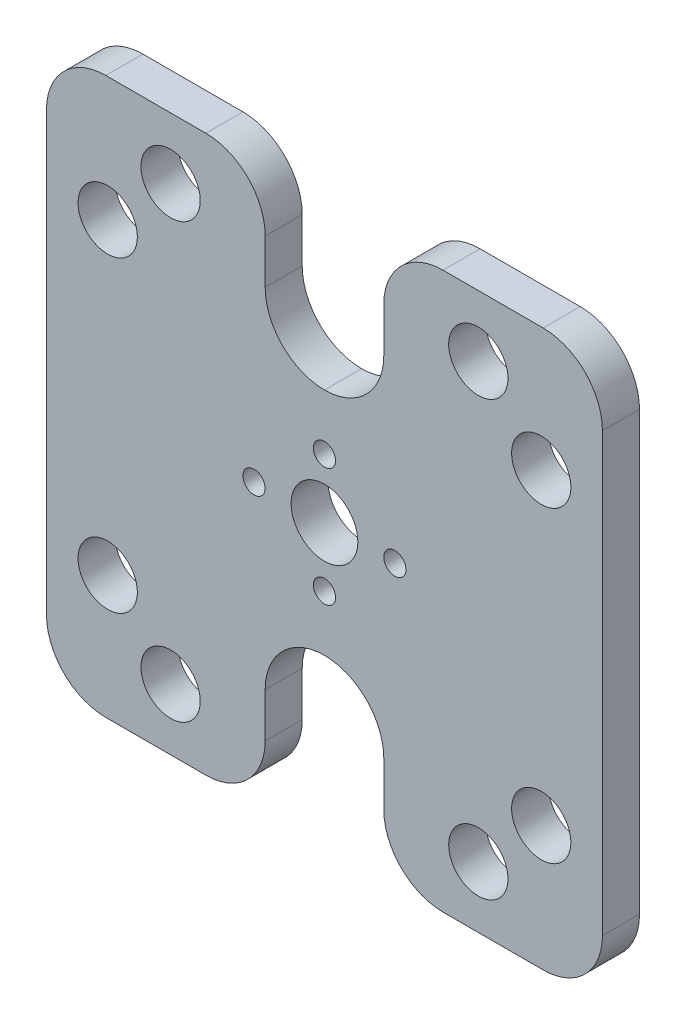
ISO-10303-21;
HEADER;
FILE_DESCRIPTION(('STEP AP214'),'2;1');
FILE_NAME('part.step','',(''),(''),'','','');
FILE_SCHEMA(('AUTOMOTIVE_DESIGN { 1 0 10303 214 1 1 1 1 }'));
ENDSEC;
DATA;
#1=APPLICATION_CONTEXT('core data for automotive mechanical design processes');
#2=APPLICATION_PROTOCOL_DEFINITION('international standard','automotive_design',2000,#1);
#3=PRODUCT_CONTEXT('',#1,'mechanical');
#4=PRODUCT('Part','Part','',(#3));
#5=PRODUCT_RELATED_PRODUCT_CATEGORY('part','',(#4));
#6=PRODUCT_DEFINITION_FORMATION('','',#4);
#7=PRODUCT_DEFINITION_CONTEXT('part definition',#1,'design');
#8=PRODUCT_DEFINITION('design','',#6,#7);
#9=PRODUCT_DEFINITION_SHAPE('','',#8);
#10=(LENGTH_UNIT() NAMED_UNIT(*) SI_UNIT(.MILLI.,.METRE.));
#11=(NAMED_UNIT(*) PLANE_ANGLE_UNIT() SI_UNIT($,.RADIAN.));
#12=(NAMED_UNIT(*) SI_UNIT($,.STERADIAN.) SOLID_ANGLE_UNIT());
#13=UNCERTAINTY_MEASURE_WITH_UNIT(LENGTH_MEASURE(1.E-05),#10,'distance_accuracy_value','');
#14=(GEOMETRIC_REPRESENTATION_CONTEXT(3) GLOBAL_UNCERTAINTY_ASSIGNED_CONTEXT((#13)) GLOBAL_UNIT_ASSIGNED_CONTEXT((#10,
#11,#12)) REPRESENTATION_CONTEXT('',''));
#15=CARTESIAN_POINT('',(0.,0.,0.));
#16=DIRECTION('',(0.,0.,1.));
#17=DIRECTION('',(1.,0.,0.));
#18=AXIS2_PLACEMENT_3D('',#15,#16,#17);
#19=CARTESIAN_POINT('',(-37.5,37.5,5.));
#20=DIRECTION('',(0.,-1.,0.));
#21=DIRECTION('',(1.,0.,0.));
#22=AXIS2_PLACEMENT_3D('',#19,#20,#21);
#23=PLANE('',#22);
#24=DIRECTION('',(-1.,0.,0.));
#25=VECTOR('',#24,1.);
#26=CARTESIAN_POINT('',(-37.5,37.5,5.));
#27=LINE('',#26,#25);
#28=CARTESIAN_POINT('',(29.5,37.5,5.));
#29=VERTEX_POINT('',#28);
#30=CARTESIAN_POINT('',(16.,37.5,5.));
#31=VERTEX_POINT('',#30);
#32=EDGE_CURVE('E427',#29,#31,#27,.T.);
#33=ORIENTED_EDGE('',*,*,#32,.F.);
#34=DIRECTION('',(0.,0.,-1.));
#35=VECTOR('',#34,1.);
#36=CARTESIAN_POINT('',(29.5,37.5,5.));
#37=LINE('',#36,#35);
#38=CARTESIAN_POINT('',(29.5,37.5,0.));
#39=VERTEX_POINT('',#38);
#40=EDGE_CURVE('E276',#29,#39,#37,.T.);
#41=ORIENTED_EDGE('',*,*,#40,.T.);
#42=DIRECTION('',(-1.,0.,0.));
#43=VECTOR('',#42,1.);
#44=CARTESIAN_POINT('',(-37.5,37.5,0.));
#45=LINE('',#44,#43);
#46=CARTESIAN_POINT('',(16.,37.5,0.));
#47=VERTEX_POINT('',#46);
#48=EDGE_CURVE('E438',#39,#47,#45,.T.);
#49=ORIENTED_EDGE('',*,*,#48,.T.);
#50=DIRECTION('',(0.,0.,1.));
#51=VECTOR('',#50,1.);
#52=CARTESIAN_POINT('',(16.,37.5,5.));
#53=LINE('',#52,#51);
#54=EDGE_CURVE('E273',#47,#31,#53,.T.);
#55=ORIENTED_EDGE('',*,*,#54,.T.);
#56=EDGE_LOOP('',(#33,#41,#49,#55));
#57=FACE_BOUND('',#56,.T.);
#58=ADVANCED_FACE('F33',(#57),#23,.F.);
#59=CARTESIAN_POINT('',(-37.5,-37.5,5.));
#60=DIRECTION('',(0.,1.,0.));
#61=DIRECTION('',(-1.,0.,0.));
#62=AXIS2_PLACEMENT_3D('',#59,#60,#61);
#63=PLANE('',#62);
#64=DIRECTION('',(1.,0.,0.));
#65=VECTOR('',#64,1.);
#66=CARTESIAN_POINT('',(-37.5,-37.5,5.));
#67=LINE('',#66,#65);
#68=CARTESIAN_POINT('',(-29.5,-37.5,5.));
#69=VERTEX_POINT('',#68);
#70=CARTESIAN_POINT('',(-16.,-37.5,5.));
#71=VERTEX_POINT('',#70);
#72=EDGE_CURVE('E203',#69,#71,#67,.T.);
#73=ORIENTED_EDGE('',*,*,#72,.F.);
#74=DIRECTION('',(0.,0.,-1.));
#75=VECTOR('',#74,1.);
#76=CARTESIAN_POINT('',(-29.5,-37.5,5.));
#77=LINE('',#76,#75);
#78=CARTESIAN_POINT('',(-29.5,-37.5,0.));
#79=VERTEX_POINT('',#78);
#80=EDGE_CURVE('E187',#69,#79,#77,.T.);
#81=ORIENTED_EDGE('',*,*,#80,.T.);
#82=DIRECTION('',(1.,0.,0.));
#83=VECTOR('',#82,1.);
#84=CARTESIAN_POINT('',(-37.5,-37.5,0.));
#85=LINE('',#84,#83);
#86=CARTESIAN_POINT('',(-16.,-37.5,0.));
#87=VERTEX_POINT('',#86);
#88=EDGE_CURVE('E200',#79,#87,#85,.T.);
#89=ORIENTED_EDGE('',*,*,#88,.T.);
#90=DIRECTION('',(0.,0.,1.));
#91=VECTOR('',#90,1.);
#92=CARTESIAN_POINT('',(-16.,-37.5,5.));
#93=LINE('',#92,#91);
#94=EDGE_CURVE('E205',#87,#71,#93,.T.);
#95=ORIENTED_EDGE('',*,*,#94,.T.);
#96=EDGE_LOOP('',(#73,#81,#89,#95));
#97=FACE_BOUND('',#96,.T.);
#98=ADVANCED_FACE('F198',(#97),#63,.F.);
#99=CARTESIAN_POINT('',(0.,0.,5.));
#100=DIRECTION('',(0.,0.,1.));
#101=DIRECTION('',(1.,0.,0.));
#102=AXIS2_PLACEMENT_3D('',#99,#100,#101);
#103=PLANE('',#102);
#104=DIRECTION('',(0.,-1.,0.));
#105=VECTOR('',#104,1.);
#106=CARTESIAN_POINT('',(-37.5,37.5,5.));
#107=LINE('',#106,#105);
#108=CARTESIAN_POINT('',(-37.5,29.5,5.));
#109=VERTEX_POINT('',#108);
#110=CARTESIAN_POINT('',(-37.5,-29.5,5.));
#111=VERTEX_POINT('',#110);
#112=EDGE_CURVE('E430',#109,#111,#107,.T.);
#113=ORIENTED_EDGE('',*,*,#112,.T.);
#114=CARTESIAN_POINT('',(-29.5,-29.5,5.));
#115=DIRECTION('',(0.,0.,1.));
#116=DIRECTION('',(1.,0.,0.));
#117=AXIS2_PLACEMENT_3D('',#114,#115,#116);
#118=CIRCLE('',#117,8.);
#119=EDGE_CURVE('E252',#111,#69,#118,.T.);
#120=ORIENTED_EDGE('',*,*,#119,.T.);
#121=ORIENTED_EDGE('',*,*,#72,.T.);
#122=CARTESIAN_POINT('',(-16.,-29.5,5.));
#123=DIRECTION('',(0.,0.,1.));
#124=DIRECTION('',(1.,0.,0.));
#125=AXIS2_PLACEMENT_3D('',#122,#123,#124);
#126=CIRCLE('',#125,8.);
#127=CARTESIAN_POINT('',(-8.,-29.5,5.));
#128=VERTEX_POINT('',#127);
#129=EDGE_CURVE('E250',#71,#128,#126,.T.);
#130=ORIENTED_EDGE('',*,*,#129,.T.);
#131=DIRECTION('',(0.,-1.,0.));
#132=VECTOR('',#131,1.);
#133=CARTESIAN_POINT('',(-8.,-15.5,5.));
#134=LINE('',#133,#132);
#135=CARTESIAN_POINT('',(-8.,-23.5,5.));
#136=VERTEX_POINT('',#135);
#137=EDGE_CURVE('E306',#136,#128,#134,.T.);
#138=ORIENTED_EDGE('',*,*,#137,.F.);
#139=CARTESIAN_POINT('',(0.,-23.5,5.));
#140=DIRECTION('',(0.,0.,1.));
#141=DIRECTION('',(1.,0.,0.));
#142=AXIS2_PLACEMENT_3D('',#139,#140,#141);
#143=CIRCLE('',#142,8.);
#144=CARTESIAN_POINT('',(0.,-15.5,5.));
#145=VERTEX_POINT('',#144);
#146=EDGE_CURVE('E297',#136,#145,#143,.F.);
#147=ORIENTED_EDGE('',*,*,#146,.T.);
#148=CARTESIAN_POINT('',(0.,-23.5,5.));
#149=DIRECTION('',(0.,0.,1.));
#150=DIRECTION('',(1.,0.,0.));
#151=AXIS2_PLACEMENT_3D('',#148,#149,#150);
#152=CIRCLE('',#151,8.);
#153=CARTESIAN_POINT('',(8.,-23.5,5.));
#154=VERTEX_POINT('',#153);
#155=EDGE_CURVE('E293',#145,#154,#152,.F.);
#156=ORIENTED_EDGE('',*,*,#155,.T.);
#157=DIRECTION('',(0.,1.,0.));
#158=VECTOR('',#157,1.);
#159=CARTESIAN_POINT('',(8.,-15.5,5.));
#160=LINE('',#159,#158);
#161=CARTESIAN_POINT('',(8.,-29.5,5.));
#162=VERTEX_POINT('',#161);
#163=EDGE_CURVE('E311',#162,#154,#160,.T.);
#164=ORIENTED_EDGE('',*,*,#163,.F.);
#165=CARTESIAN_POINT('',(16.,-29.5,5.));
#166=DIRECTION('',(0.,0.,1.));
#167=DIRECTION('',(1.,0.,0.));
#168=AXIS2_PLACEMENT_3D('',#165,#166,#167);
#169=CIRCLE('',#168,8.);
#170=CARTESIAN_POINT('',(16.,-37.5,5.));
#171=VERTEX_POINT('',#170);
#172=EDGE_CURVE('E248',#162,#171,#169,.T.);
#173=ORIENTED_EDGE('',*,*,#172,.T.);
#174=CARTESIAN_POINT('',(29.5,-37.5,5.));
#175=VERTEX_POINT('',#174);
#176=EDGE_CURVE('E432',#171,#175,#67,.T.);
#177=ORIENTED_EDGE('',*,*,#176,.T.);
#178=CARTESIAN_POINT('',(29.5,-29.5,5.));
#179=DIRECTION('',(0.,0.,1.));
#180=DIRECTION('',(1.,0.,0.));
#181=AXIS2_PLACEMENT_3D('',#178,#179,#180);
#182=CIRCLE('',#181,8.);
#183=CARTESIAN_POINT('',(37.5,-29.5,5.));
#184=VERTEX_POINT('',#183);
#185=EDGE_CURVE('E246',#175,#184,#182,.T.);
#186=ORIENTED_EDGE('',*,*,#185,.T.);
#187=DIRECTION('',(0.,1.,0.));
#188=VECTOR('',#187,1.);
#189=CARTESIAN_POINT('',(37.5,37.5,5.));
#190=LINE('',#189,#188);
#191=CARTESIAN_POINT('',(37.5,29.5,5.));
#192=VERTEX_POINT('',#191);
#193=EDGE_CURVE('E211',#184,#192,#190,.T.);
#194=ORIENTED_EDGE('',*,*,#193,.T.);
#195=CARTESIAN_POINT('',(29.5,29.5,5.));
#196=DIRECTION('',(0.,0.,1.));
#197=DIRECTION('',(1.,0.,0.));
#198=AXIS2_PLACEMENT_3D('',#195,#196,#197);
#199=CIRCLE('',#198,8.);
#200=EDGE_CURVE('E244',#192,#29,#199,.T.);
#201=ORIENTED_EDGE('',*,*,#200,.T.);
#202=ORIENTED_EDGE('',*,*,#32,.T.);
#203=CARTESIAN_POINT('',(16.,29.5,5.));
#204=DIRECTION('',(0.,0.,1.));
#205=DIRECTION('',(1.,0.,0.));
#206=AXIS2_PLACEMENT_3D('',#203,#204,#205);
#207=CIRCLE('',#206,8.);
#208=CARTESIAN_POINT('',(8.,29.5,5.));
#209=VERTEX_POINT('',#208);
#210=EDGE_CURVE('E242',#31,#209,#207,.T.);
#211=ORIENTED_EDGE('',*,*,#210,.T.);
#212=DIRECTION('',(0.,1.,0.));
#213=VECTOR('',#212,1.);
#214=CARTESIAN_POINT('',(8.,15.5,5.));
#215=LINE('',#214,#213);
#216=CARTESIAN_POINT('',(8.,23.5,5.));
#217=VERTEX_POINT('',#216);
#218=EDGE_CURVE('E332',#217,#209,#215,.T.);
#219=ORIENTED_EDGE('',*,*,#218,.F.);
#220=CARTESIAN_POINT('',(0.,23.5,5.));
#221=DIRECTION('',(0.,0.,1.));
#222=DIRECTION('',(1.,0.,0.));
#223=AXIS2_PLACEMENT_3D('',#220,#221,#222);
#224=CIRCLE('',#223,8.);
#225=CARTESIAN_POINT('',(0.,15.5,5.));
#226=VERTEX_POINT('',#225);
#227=EDGE_CURVE('E56',#217,#226,#224,.F.);
#228=ORIENTED_EDGE('',*,*,#227,.T.);
#229=CARTESIAN_POINT('',(0.,23.5,5.));
#230=DIRECTION('',(0.,0.,1.));
#231=DIRECTION('',(1.,0.,0.));
#232=AXIS2_PLACEMENT_3D('',#229,#230,#231);
#233=CIRCLE('',#232,8.);
#234=CARTESIAN_POINT('',(-8.,23.5,5.));
#235=VERTEX_POINT('',#234);
#236=EDGE_CURVE('E42',#226,#235,#233,.F.);
#237=ORIENTED_EDGE('',*,*,#236,.T.);
#238=DIRECTION('',(0.,-1.,0.));
#239=VECTOR('',#238,1.);
#240=CARTESIAN_POINT('',(-8.,15.5,5.));
#241=LINE('',#240,#239);
#242=CARTESIAN_POINT('',(-8.,29.5,5.));
#243=VERTEX_POINT('',#242);
#244=EDGE_CURVE('E326',#243,#235,#241,.T.);
#245=ORIENTED_EDGE('',*,*,#244,.F.);
#246=CARTESIAN_POINT('',(-16.,29.5,5.));
#247=DIRECTION('',(0.,0.,1.));
#248=DIRECTION('',(1.,0.,0.));
#249=AXIS2_PLACEMENT_3D('',#246,#247,#248);
#250=CIRCLE('',#249,8.);
#251=CARTESIAN_POINT('',(-16.,37.5,5.));
#252=VERTEX_POINT('',#251);
#253=EDGE_CURVE('E240',#243,#252,#250,.T.);
#254=ORIENTED_EDGE('',*,*,#253,.T.);
#255=CARTESIAN_POINT('',(-29.5,37.5,5.));
#256=VERTEX_POINT('',#255);
#257=EDGE_CURVE('E215',#252,#256,#27,.T.);
#258=ORIENTED_EDGE('',*,*,#257,.T.);
#259=CARTESIAN_POINT('',(-29.5,29.5,5.));
#260=DIRECTION('',(0.,0.,1.));
#261=DIRECTION('',(1.,0.,0.));
#262=AXIS2_PLACEMENT_3D('',#259,#260,#261);
#263=CIRCLE('',#262,8.);
#264=EDGE_CURVE('E238',#256,#109,#263,.T.);
#265=ORIENTED_EDGE('',*,*,#264,.T.);
#266=EDGE_LOOP('',(#113,#120,#121,#130,#138,#147,#156,#164,#173,#177,#186,#194,#201,#202,#211,
#219,#228,#237,#245,#254,#258,#265));
#267=FACE_BOUND('',#266,.T.);
#268=CARTESIAN_POINT('',(20.7573593128807,-29.2426406871193,5.));
#269=DIRECTION('',(0.,0.,1.));
#270=DIRECTION('',(-1.,0.,0.));
#271=AXIS2_PLACEMENT_3D('',#268,#269,#270);
#272=CIRCLE('',#271,4.);
#273=CARTESIAN_POINT('',(16.7573593128807,-29.2426406871193,5.));
#274=VERTEX_POINT('',#273);
#275=EDGE_CURVE('E355',#274,#274,#272,.T.);
#276=ORIENTED_EDGE('',*,*,#275,.F.);
#277=EDGE_LOOP('',(#276));
#278=FACE_BOUND('',#277,.T.);
#279=CARTESIAN_POINT('',(-20.7573593128808,29.2426406871193,5.));
#280=DIRECTION('',(0.,0.,1.));
#281=DIRECTION('',(-1.,0.,0.));
#282=AXIS2_PLACEMENT_3D('',#279,#280,#281);
#283=CIRCLE('',#282,3.99999999999989);
#284=CARTESIAN_POINT('',(-24.7573593128807,29.2426406871193,5.));
#285=VERTEX_POINT('',#284);
#286=EDGE_CURVE('E367',#285,#285,#283,.T.);
#287=ORIENTED_EDGE('',*,*,#286,.F.);
#288=EDGE_LOOP('',(#287));
#289=FACE_BOUND('',#288,.T.);
#290=CARTESIAN_POINT('',(0.,0.,5.));
#291=DIRECTION('',(0.,0.,1.));
#292=DIRECTION('',(1.,0.,0.));
#293=AXIS2_PLACEMENT_3D('',#290,#291,#292);
#294=CIRCLE('',#293,4.5);
#295=CARTESIAN_POINT('',(4.5,0.,5.));
#296=VERTEX_POINT('',#295);
#297=EDGE_CURVE('E379',#296,#296,#294,.T.);
#298=ORIENTED_EDGE('',*,*,#297,.F.);
#299=EDGE_LOOP('',(#298));
#300=FACE_BOUND('',#299,.T.);
#301=CARTESIAN_POINT('',(-29.2426406871193,-20.7573593128808,5.));
#302=DIRECTION('',(0.,0.,1.));
#303=DIRECTION('',(-1.,0.,0.));
#304=AXIS2_PLACEMENT_3D('',#301,#302,#303);
#305=CIRCLE('',#304,3.9999999999999);
#306=CARTESIAN_POINT('',(-33.2426406871192,-20.7573593128808,5.));
#307=VERTEX_POINT('',#306);
#308=EDGE_CURVE('E391',#307,#307,#305,.T.);
#309=ORIENTED_EDGE('',*,*,#308,.F.);
#310=EDGE_LOOP('',(#309));
#311=FACE_BOUND('',#310,.T.);
#312=CARTESIAN_POINT('',(0.,-8.,5.));
#313=DIRECTION('',(0.,0.,1.));
#314=DIRECTION('',(1.,0.,0.));
#315=AXIS2_PLACEMENT_3D('',#312,#313,#314);
#316=CIRCLE('',#315,1.5);
#317=CARTESIAN_POINT('',(1.5,-8.,5.));
#318=VERTEX_POINT('',#317);
#319=EDGE_CURVE('E403',#318,#318,#316,.T.);
#320=ORIENTED_EDGE('',*,*,#319,.F.);
#321=EDGE_LOOP('',(#320));
#322=FACE_BOUND('',#321,.T.);
#323=CARTESIAN_POINT('',(9.5,0.,5.));
#324=DIRECTION('',(0.,0.,1.));
#325=DIRECTION('',(1.,0.,0.));
#326=AXIS2_PLACEMENT_3D('',#323,#324,#325);
#327=CIRCLE('',#326,1.5);
#328=CARTESIAN_POINT('',(11.,0.,5.));
#329=VERTEX_POINT('',#328);
#330=EDGE_CURVE('E415',#329,#329,#327,.T.);
#331=ORIENTED_EDGE('',*,*,#330,.F.);
#332=EDGE_LOOP('',(#331));
#333=FACE_BOUND('',#332,.T.);
#334=CARTESIAN_POINT('',(-9.5,0.,5.));
#335=DIRECTION('',(0.,0.,1.));
#336=DIRECTION('',(1.,0.,0.));
#337=AXIS2_PLACEMENT_3D('',#334,#335,#336);
#338=CIRCLE('',#337,1.5);
#339=CARTESIAN_POINT('',(-8.,0.,5.));
#340=VERTEX_POINT('',#339);
#341=EDGE_CURVE('E421',#340,#340,#338,.T.);
#342=ORIENTED_EDGE('',*,*,#341,.F.);
#343=EDGE_LOOP('',(#342));
#344=FACE_BOUND('',#343,.T.);
#345=CARTESIAN_POINT('',(0.,8.,5.));
#346=DIRECTION('',(0.,0.,1.));
#347=DIRECTION('',(1.,0.,0.));
#348=AXIS2_PLACEMENT_3D('',#345,#346,#347);
#349=CIRCLE('',#348,1.5);
#350=CARTESIAN_POINT('',(1.5,8.,5.));
#351=VERTEX_POINT('',#350);
#352=EDGE_CURVE('E409',#351,#351,#349,.T.);
#353=ORIENTED_EDGE('',*,*,#352,.F.);
#354=EDGE_LOOP('',(#353));
#355=FACE_BOUND('',#354,.T.);
#356=CARTESIAN_POINT('',(-20.7573593128807,-29.2426406871193,5.));
#357=DIRECTION('',(0.,0.,1.));
#358=DIRECTION('',(1.,0.,0.));
#359=AXIS2_PLACEMENT_3D('',#356,#357,#358);
#360=CIRCLE('',#359,4.);
#361=CARTESIAN_POINT('',(-16.7573593128807,-29.2426406871193,5.));
#362=VERTEX_POINT('',#361);
#363=EDGE_CURVE('E397',#362,#362,#360,.T.);
#364=ORIENTED_EDGE('',*,*,#363,.F.);
#365=EDGE_LOOP('',(#364));
#366=FACE_BOUND('',#365,.T.);
#367=CARTESIAN_POINT('',(29.2426406871193,20.7573593128807,5.));
#368=DIRECTION('',(0.,0.,1.));
#369=DIRECTION('',(-1.,0.,0.));
#370=AXIS2_PLACEMENT_3D('',#367,#368,#369);
#371=CIRCLE('',#370,3.99999999999997);
#372=CARTESIAN_POINT('',(25.2426406871193,20.7573593128807,5.));
#373=VERTEX_POINT('',#372);
#374=EDGE_CURVE('E385',#373,#373,#371,.T.);
#375=ORIENTED_EDGE('',*,*,#374,.F.);
#376=EDGE_LOOP('',(#375));
#377=FACE_BOUND('',#376,.T.);
#378=CARTESIAN_POINT('',(20.7573593128808,29.2426406871193,5.));
#379=DIRECTION('',(0.,0.,1.));
#380=DIRECTION('',(1.,0.,0.));
#381=AXIS2_PLACEMENT_3D('',#378,#379,#380);
#382=CIRCLE('',#381,3.99999999999989);
#383=CARTESIAN_POINT('',(24.7573593128807,29.2426406871193,5.));
#384=VERTEX_POINT('',#383);
#385=EDGE_CURVE('E373',#384,#384,#382,.T.);
#386=ORIENTED_EDGE('',*,*,#385,.F.);
#387=EDGE_LOOP('',(#386));
#388=FACE_BOUND('',#387,.T.);
#389=CARTESIAN_POINT('',(-29.2426406871193,20.7573593128807,5.));
#390=DIRECTION('',(0.,0.,1.));
#391=DIRECTION('',(1.,0.,0.));
#392=AXIS2_PLACEMENT_3D('',#389,#390,#391);
#393=CIRCLE('',#392,3.99999999999996);
#394=CARTESIAN_POINT('',(-25.2426406871193,20.7573593128807,5.));
#395=VERTEX_POINT('',#394);
#396=EDGE_CURVE('E361',#395,#395,#393,.T.);
#397=ORIENTED_EDGE('',*,*,#396,.F.);
#398=EDGE_LOOP('',(#397));
#399=FACE_BOUND('',#398,.T.);
#400=CARTESIAN_POINT('',(29.2426406871193,-20.7573593128808,5.));
#401=DIRECTION('',(0.,0.,1.));
#402=DIRECTION('',(1.,0.,0.));
#403=AXIS2_PLACEMENT_3D('',#400,#401,#402);
#404=CIRCLE('',#403,3.9999999999999);
#405=CARTESIAN_POINT('',(33.2426406871192,-20.7573593128808,5.));
#406=VERTEX_POINT('',#405);
#407=EDGE_CURVE('E348',#406,#406,#404,.T.);
#408=ORIENTED_EDGE('',*,*,#407,.F.);
#409=EDGE_LOOP('',(#408));
#410=FACE_BOUND('',#409,.T.);
#411=ADVANCED_FACE('F324',(#267,#278,#289,#300,#311,#322,#333,#344,#355,#366,#377,#388,#399,
#410),#103,.T.);
#412=CARTESIAN_POINT('',(0.,0.,0.));
#413=DIRECTION('',(0.,0.,1.));
#414=DIRECTION('',(1.,0.,0.));
#415=AXIS2_PLACEMENT_3D('',#412,#413,#414);
#416=PLANE('',#415);
#417=ORIENTED_EDGE('',*,*,#88,.F.);
#418=CARTESIAN_POINT('',(-29.5,-29.5,0.));
#419=DIRECTION('',(0.,0.,1.));
#420=DIRECTION('',(1.,0.,0.));
#421=AXIS2_PLACEMENT_3D('',#418,#419,#420);
#422=CIRCLE('',#421,8.);
#423=CARTESIAN_POINT('',(-37.5,-29.5,0.));
#424=VERTEX_POINT('',#423);
#425=EDGE_CURVE('E183',#79,#424,#422,.F.);
#426=ORIENTED_EDGE('',*,*,#425,.T.);
#427=DIRECTION('',(0.,-1.,0.));
#428=VECTOR('',#427,1.);
#429=CARTESIAN_POINT('',(-37.5,37.5,0.));
#430=LINE('',#429,#428);
#431=CARTESIAN_POINT('',(-37.5,29.5,0.));
#432=VERTEX_POINT('',#431);
#433=EDGE_CURVE('E218',#432,#424,#430,.T.);
#434=ORIENTED_EDGE('',*,*,#433,.F.);
#435=CARTESIAN_POINT('',(-29.5,29.5,0.));
#436=DIRECTION('',(0.,0.,1.));
#437=DIRECTION('',(1.,0.,0.));
#438=AXIS2_PLACEMENT_3D('',#435,#436,#437);
#439=CIRCLE('',#438,8.);
#440=CARTESIAN_POINT('',(-29.5,37.5,0.));
#441=VERTEX_POINT('',#440);
#442=EDGE_CURVE('E204',#432,#441,#439,.F.);
#443=ORIENTED_EDGE('',*,*,#442,.T.);
#444=CARTESIAN_POINT('',(-16.,37.5,0.));
#445=VERTEX_POINT('',#444);
#446=EDGE_CURVE('E436',#445,#441,#45,.T.);
#447=ORIENTED_EDGE('',*,*,#446,.F.);
#448=CARTESIAN_POINT('',(-16.,29.5,0.));
#449=DIRECTION('',(0.,0.,1.));
#450=DIRECTION('',(1.,0.,0.));
#451=AXIS2_PLACEMENT_3D('',#448,#449,#450);
#452=CIRCLE('',#451,8.);
#453=CARTESIAN_POINT('',(-8.,29.5,0.));
#454=VERTEX_POINT('',#453);
#455=EDGE_CURVE('E224',#445,#454,#452,.F.);
#456=ORIENTED_EDGE('',*,*,#455,.T.);
#457=DIRECTION('',(0.,1.,0.));
#458=VECTOR('',#457,1.);
#459=CARTESIAN_POINT('',(-8.,15.5,0.));
#460=LINE('',#459,#458);
#461=CARTESIAN_POINT('',(-8.,23.5,0.));
#462=VERTEX_POINT('',#461);
#463=EDGE_CURVE('E331',#462,#454,#460,.T.);
#464=ORIENTED_EDGE('',*,*,#463,.F.);
#465=CARTESIAN_POINT('',(0.,23.5,0.));
#466=DIRECTION('',(0.,0.,1.));
#467=DIRECTION('',(1.,0.,0.));
#468=AXIS2_PLACEMENT_3D('',#465,#466,#467);
#469=CIRCLE('',#468,8.);
#470=CARTESIAN_POINT('',(0.,15.5,0.));
#471=VERTEX_POINT('',#470);
#472=EDGE_CURVE('E11',#462,#471,#469,.T.);
#473=ORIENTED_EDGE('',*,*,#472,.T.);
#474=CARTESIAN_POINT('',(0.,23.5,0.));
#475=DIRECTION('',(0.,0.,1.));
#476=DIRECTION('',(1.,0.,0.));
#477=AXIS2_PLACEMENT_3D('',#474,#475,#476);
#478=CIRCLE('',#477,8.);
#479=CARTESIAN_POINT('',(8.,23.5,0.));
#480=VERTEX_POINT('',#479);
#481=EDGE_CURVE('E302',#471,#480,#478,.T.);
#482=ORIENTED_EDGE('',*,*,#481,.T.);
#483=DIRECTION('',(0.,-1.,0.));
#484=VECTOR('',#483,1.);
#485=CARTESIAN_POINT('',(8.,15.5,0.));
#486=LINE('',#485,#484);
#487=CARTESIAN_POINT('',(8.,29.5,0.));
#488=VERTEX_POINT('',#487);
#489=EDGE_CURVE('E334',#488,#480,#486,.T.);
#490=ORIENTED_EDGE('',*,*,#489,.F.);
#491=CARTESIAN_POINT('',(16.,29.5,0.));
#492=DIRECTION('',(0.,0.,1.));
#493=DIRECTION('',(1.,0.,0.));
#494=AXIS2_PLACEMENT_3D('',#491,#492,#493);
#495=CIRCLE('',#494,8.);
#496=EDGE_CURVE('E226',#488,#47,#495,.F.);
#497=ORIENTED_EDGE('',*,*,#496,.T.);
#498=ORIENTED_EDGE('',*,*,#48,.F.);
#499=CARTESIAN_POINT('',(29.5,29.5,0.));
#500=DIRECTION('',(0.,0.,1.));
#501=DIRECTION('',(1.,0.,0.));
#502=AXIS2_PLACEMENT_3D('',#499,#500,#501);
#503=CIRCLE('',#502,8.);
#504=CARTESIAN_POINT('',(37.5,29.5,0.));
#505=VERTEX_POINT('',#504);
#506=EDGE_CURVE('E228',#39,#505,#503,.F.);
#507=ORIENTED_EDGE('',*,*,#506,.T.);
#508=DIRECTION('',(0.,1.,0.));
#509=VECTOR('',#508,1.);
#510=CARTESIAN_POINT('',(37.5,37.5,0.));
#511=LINE('',#510,#509);
#512=CARTESIAN_POINT('',(37.5,-29.5,0.));
#513=VERTEX_POINT('',#512);
#514=EDGE_CURVE('E424',#513,#505,#511,.T.);
#515=ORIENTED_EDGE('',*,*,#514,.F.);
#516=CARTESIAN_POINT('',(29.5,-29.5,0.));
#517=DIRECTION('',(0.,0.,1.));
#518=DIRECTION('',(1.,0.,0.));
#519=AXIS2_PLACEMENT_3D('',#516,#517,#518);
#520=CIRCLE('',#519,8.);
#521=CARTESIAN_POINT('',(29.5,-37.5,0.));
#522=VERTEX_POINT('',#521);
#523=EDGE_CURVE('E230',#513,#522,#520,.F.);
#524=ORIENTED_EDGE('',*,*,#523,.T.);
#525=CARTESIAN_POINT('',(16.,-37.5,0.));
#526=VERTEX_POINT('',#525);
#527=EDGE_CURVE('E212',#526,#522,#85,.T.);
#528=ORIENTED_EDGE('',*,*,#527,.F.);
#529=CARTESIAN_POINT('',(16.,-29.5,0.));
#530=DIRECTION('',(0.,0.,1.));
#531=DIRECTION('',(1.,0.,0.));
#532=AXIS2_PLACEMENT_3D('',#529,#530,#531);
#533=CIRCLE('',#532,8.);
#534=CARTESIAN_POINT('',(8.,-29.5,0.));
#535=VERTEX_POINT('',#534);
#536=EDGE_CURVE('E232',#526,#535,#533,.F.);
#537=ORIENTED_EDGE('',*,*,#536,.T.);
#538=DIRECTION('',(0.,-1.,0.));
#539=VECTOR('',#538,1.);
#540=CARTESIAN_POINT('',(8.,-15.5,0.));
#541=LINE('',#540,#539);
#542=CARTESIAN_POINT('',(8.,-23.5,0.));
#543=VERTEX_POINT('',#542);
#544=EDGE_CURVE('E341',#543,#535,#541,.T.);
#545=ORIENTED_EDGE('',*,*,#544,.F.);
#546=CARTESIAN_POINT('',(0.,-23.5,0.));
#547=DIRECTION('',(0.,0.,1.));
#548=DIRECTION('',(1.,0.,0.));
#549=AXIS2_PLACEMENT_3D('',#546,#547,#548);
#550=CIRCLE('',#549,8.);
#551=CARTESIAN_POINT('',(0.,-15.5,0.));
#552=VERTEX_POINT('',#551);
#553=EDGE_CURVE('E295',#543,#552,#550,.T.);
#554=ORIENTED_EDGE('',*,*,#553,.T.);
#555=CARTESIAN_POINT('',(0.,-23.5,0.));
#556=DIRECTION('',(0.,0.,1.));
#557=DIRECTION('',(1.,0.,0.));
#558=AXIS2_PLACEMENT_3D('',#555,#556,#557);
#559=CIRCLE('',#558,8.);
#560=CARTESIAN_POINT('',(-8.,-23.5,0.));
#561=VERTEX_POINT('',#560);
#562=EDGE_CURVE('E299',#552,#561,#559,.T.);
#563=ORIENTED_EDGE('',*,*,#562,.T.);
#564=DIRECTION('',(0.,1.,0.));
#565=VECTOR('',#564,1.);
#566=CARTESIAN_POINT('',(-8.,-15.5,0.));
#567=LINE('',#566,#565);
#568=CARTESIAN_POINT('',(-8.,-29.5,0.));
#569=VERTEX_POINT('',#568);
#570=EDGE_CURVE('E337',#569,#561,#567,.T.);
#571=ORIENTED_EDGE('',*,*,#570,.F.);
#572=CARTESIAN_POINT('',(-16.,-29.5,0.));
#573=DIRECTION('',(0.,0.,1.));
#574=DIRECTION('',(1.,0.,0.));
#575=AXIS2_PLACEMENT_3D('',#572,#573,#574);
#576=CIRCLE('',#575,8.);
#577=EDGE_CURVE('E193',#569,#87,#576,.F.);
#578=ORIENTED_EDGE('',*,*,#577,.T.);
#579=EDGE_LOOP('',(#417,#426,#434,#443,#447,#456,#464,#473,#482,#490,#497,#498,#507,#515,#524,
#528,#537,#545,#554,#563,#571,#578));
#580=FACE_BOUND('',#579,.T.);
#581=CARTESIAN_POINT('',(-9.5,0.,0.));
#582=DIRECTION('',(0.,0.,1.));
#583=DIRECTION('',(1.,0.,0.));
#584=AXIS2_PLACEMENT_3D('',#581,#582,#583);
#585=CIRCLE('',#584,1.5);
#586=CARTESIAN_POINT('',(-8.,0.,0.));
#587=VERTEX_POINT('',#586);
#588=EDGE_CURVE('E418',#587,#587,#585,.T.);
#589=ORIENTED_EDGE('',*,*,#588,.T.);
#590=EDGE_LOOP('',(#589));
#591=FACE_BOUND('',#590,.T.);
#592=CARTESIAN_POINT('',(9.5,0.,0.));
#593=DIRECTION('',(0.,0.,1.));
#594=DIRECTION('',(1.,0.,0.));
#595=AXIS2_PLACEMENT_3D('',#592,#593,#594);
#596=CIRCLE('',#595,1.5);
#597=CARTESIAN_POINT('',(11.,0.,0.));
#598=VERTEX_POINT('',#597);
#599=EDGE_CURVE('E412',#598,#598,#596,.T.);
#600=ORIENTED_EDGE('',*,*,#599,.T.);
#601=EDGE_LOOP('',(#600));
#602=FACE_BOUND('',#601,.T.);
#603=CARTESIAN_POINT('',(0.,8.,0.));
#604=DIRECTION('',(0.,0.,1.));
#605=DIRECTION('',(1.,0.,0.));
#606=AXIS2_PLACEMENT_3D('',#603,#604,#605);
#607=CIRCLE('',#606,1.5);
#608=CARTESIAN_POINT('',(1.5,8.,0.));
#609=VERTEX_POINT('',#608);
#610=EDGE_CURVE('E406',#609,#609,#607,.T.);
#611=ORIENTED_EDGE('',*,*,#610,.T.);
#612=EDGE_LOOP('',(#611));
#613=FACE_BOUND('',#612,.T.);
#614=CARTESIAN_POINT('',(0.,-8.,0.));
#615=DIRECTION('',(0.,0.,1.));
#616=DIRECTION('',(1.,0.,0.));
#617=AXIS2_PLACEMENT_3D('',#614,#615,#616);
#618=CIRCLE('',#617,1.5);
#619=CARTESIAN_POINT('',(1.5,-8.,0.));
#620=VERTEX_POINT('',#619);
#621=EDGE_CURVE('E400',#620,#620,#618,.T.);
#622=ORIENTED_EDGE('',*,*,#621,.T.);
#623=EDGE_LOOP('',(#622));
#624=FACE_BOUND('',#623,.T.);
#625=CARTESIAN_POINT('',(-20.7573593128807,-29.2426406871193,0.));
#626=DIRECTION('',(0.,0.,1.));
#627=DIRECTION('',(1.,0.,0.));
#628=AXIS2_PLACEMENT_3D('',#625,#626,#627);
#629=CIRCLE('',#628,4.);
#630=CARTESIAN_POINT('',(-16.7573593128807,-29.2426406871193,0.));
#631=VERTEX_POINT('',#630);
#632=EDGE_CURVE('E394',#631,#631,#629,.T.);
#633=ORIENTED_EDGE('',*,*,#632,.T.);
#634=EDGE_LOOP('',(#633));
#635=FACE_BOUND('',#634,.T.);
#636=CARTESIAN_POINT('',(-29.2426406871193,-20.7573593128808,0.));
#637=DIRECTION('',(0.,0.,1.));
#638=DIRECTION('',(-1.,0.,0.));
#639=AXIS2_PLACEMENT_3D('',#636,#637,#638);
#640=CIRCLE('',#639,3.9999999999999);
#641=CARTESIAN_POINT('',(-33.2426406871192,-20.7573593128808,0.));
#642=VERTEX_POINT('',#641);
#643=EDGE_CURVE('E388',#642,#642,#640,.T.);
#644=ORIENTED_EDGE('',*,*,#643,.T.);
#645=EDGE_LOOP('',(#644));
#646=FACE_BOUND('',#645,.T.);
#647=CARTESIAN_POINT('',(29.2426406871193,20.7573593128807,0.));
#648=DIRECTION('',(0.,0.,1.));
#649=DIRECTION('',(-1.,0.,0.));
#650=AXIS2_PLACEMENT_3D('',#647,#648,#649);
#651=CIRCLE('',#650,3.99999999999997);
#652=CARTESIAN_POINT('',(25.2426406871193,20.7573593128807,0.));
#653=VERTEX_POINT('',#652);
#654=EDGE_CURVE('E382',#653,#653,#651,.T.);
#655=ORIENTED_EDGE('',*,*,#654,.T.);
#656=EDGE_LOOP('',(#655));
#657=FACE_BOUND('',#656,.T.);
#658=CARTESIAN_POINT('',(0.,0.,0.));
#659=DIRECTION('',(0.,0.,1.));
#660=DIRECTION('',(1.,0.,0.));
#661=AXIS2_PLACEMENT_3D('',#658,#659,#660);
#662=CIRCLE('',#661,4.5);
#663=CARTESIAN_POINT('',(4.5,0.,0.));
#664=VERTEX_POINT('',#663);
#665=EDGE_CURVE('E376',#664,#664,#662,.T.);
#666=ORIENTED_EDGE('',*,*,#665,.T.);
#667=EDGE_LOOP('',(#666));
#668=FACE_BOUND('',#667,.T.);
#669=CARTESIAN_POINT('',(20.7573593128808,29.2426406871193,0.));
#670=DIRECTION('',(0.,0.,1.));
#671=DIRECTION('',(1.,0.,0.));
#672=AXIS2_PLACEMENT_3D('',#669,#670,#671);
#673=CIRCLE('',#672,3.99999999999989);
#674=CARTESIAN_POINT('',(24.7573593128807,29.2426406871193,0.));
#675=VERTEX_POINT('',#674);
#676=EDGE_CURVE('E370',#675,#675,#673,.T.);
#677=ORIENTED_EDGE('',*,*,#676,.T.);
#678=EDGE_LOOP('',(#677));
#679=FACE_BOUND('',#678,.T.);
#680=CARTESIAN_POINT('',(-20.7573593128808,29.2426406871193,0.));
#681=DIRECTION('',(0.,0.,1.));
#682=DIRECTION('',(-1.,0.,0.));
#683=AXIS2_PLACEMENT_3D('',#680,#681,#682);
#684=CIRCLE('',#683,3.99999999999989);
#685=CARTESIAN_POINT('',(-24.7573593128807,29.2426406871193,0.));
#686=VERTEX_POINT('',#685);
#687=EDGE_CURVE('E364',#686,#686,#684,.T.);
#688=ORIENTED_EDGE('',*,*,#687,.T.);
#689=EDGE_LOOP('',(#688));
#690=FACE_BOUND('',#689,.T.);
#691=CARTESIAN_POINT('',(-29.2426406871193,20.7573593128807,0.));
#692=DIRECTION('',(0.,0.,1.));
#693=DIRECTION('',(1.,0.,0.));
#694=AXIS2_PLACEMENT_3D('',#691,#692,#693);
#695=CIRCLE('',#694,3.99999999999996);
#696=CARTESIAN_POINT('',(-25.2426406871193,20.7573593128807,0.));
#697=VERTEX_POINT('',#696);
#698=EDGE_CURVE('E358',#697,#697,#695,.T.);
#699=ORIENTED_EDGE('',*,*,#698,.T.);
#700=EDGE_LOOP('',(#699));
#701=FACE_BOUND('',#700,.T.);
#702=CARTESIAN_POINT('',(20.7573593128807,-29.2426406871193,0.));
#703=DIRECTION('',(0.,0.,1.));
#704=DIRECTION('',(-1.,0.,0.));
#705=AXIS2_PLACEMENT_3D('',#702,#703,#704);
#706=CIRCLE('',#705,4.);
#707=CARTESIAN_POINT('',(16.7573593128807,-29.2426406871193,0.));
#708=VERTEX_POINT('',#707);
#709=EDGE_CURVE('E351',#708,#708,#706,.T.);
#710=ORIENTED_EDGE('',*,*,#709,.T.);
#711=EDGE_LOOP('',(#710));
#712=FACE_BOUND('',#711,.T.);
#713=CARTESIAN_POINT('',(29.2426406871193,-20.7573593128808,0.));
#714=DIRECTION('',(0.,0.,1.));
#715=DIRECTION('',(1.,0.,0.));
#716=AXIS2_PLACEMENT_3D('',#713,#714,#715);
#717=CIRCLE('',#716,3.9999999999999);
#718=CARTESIAN_POINT('',(33.2426406871192,-20.7573593128808,0.));
#719=VERTEX_POINT('',#718);
#720=EDGE_CURVE('E352',#719,#719,#717,.T.);
#721=ORIENTED_EDGE('',*,*,#720,.T.);
#722=EDGE_LOOP('',(#721));
#723=FACE_BOUND('',#722,.T.);
#724=ADVANCED_FACE('F207',(#580,#591,#602,#613,#624,#635,#646,#657,#668,#679,#690,#701,#712,
#723),#416,.F.);
#725=CARTESIAN_POINT('',(37.5,37.5,5.));
#726=DIRECTION('',(-1.,0.,0.));
#727=DIRECTION('',(0.,0.,1.));
#728=AXIS2_PLACEMENT_3D('',#725,#726,#727);
#729=PLANE('',#728);
#730=ORIENTED_EDGE('',*,*,#193,.F.);
#731=DIRECTION('',(0.,0.,-1.));
#732=VECTOR('',#731,1.);
#733=CARTESIAN_POINT('',(37.5,-29.5,5.));
#734=LINE('',#733,#732);
#735=EDGE_CURVE('E270',#184,#513,#734,.T.);
#736=ORIENTED_EDGE('',*,*,#735,.T.);
#737=ORIENTED_EDGE('',*,*,#514,.T.);
#738=DIRECTION('',(0.,0.,-1.));
#739=VECTOR('',#738,1.);
#740=CARTESIAN_POINT('',(37.5,29.5,5.));
#741=LINE('',#740,#739);
#742=EDGE_CURVE('E268',#505,#192,#741,.F.);
#743=ORIENTED_EDGE('',*,*,#742,.T.);
#744=EDGE_LOOP('',(#730,#736,#737,#743));
#745=FACE_BOUND('',#744,.T.);
#746=ADVANCED_FACE('F477',(#745),#729,.F.);
#747=ORIENTED_EDGE('',*,*,#257,.F.);
#748=DIRECTION('',(0.,0.,1.));
#749=VECTOR('',#748,1.);
#750=CARTESIAN_POINT('',(-16.,37.5,5.));
#751=LINE('',#750,#749);
#752=EDGE_CURVE('E291',#252,#445,#751,.F.);
#753=ORIENTED_EDGE('',*,*,#752,.T.);
#754=ORIENTED_EDGE('',*,*,#446,.T.);
#755=DIRECTION('',(0.,0.,-1.));
#756=VECTOR('',#755,1.);
#757=CARTESIAN_POINT('',(-29.5,37.5,5.));
#758=LINE('',#757,#756);
#759=EDGE_CURVE('E289',#441,#256,#758,.F.);
#760=ORIENTED_EDGE('',*,*,#759,.T.);
#761=EDGE_LOOP('',(#747,#753,#754,#760));
#762=FACE_BOUND('',#761,.T.);
#763=ADVANCED_FACE('F455',(#762),#23,.F.);
#764=CARTESIAN_POINT('',(-37.5,37.5,5.));
#765=DIRECTION('',(1.,0.,0.));
#766=DIRECTION('',(0.,0.,-1.));
#767=AXIS2_PLACEMENT_3D('',#764,#765,#766);
#768=PLANE('',#767);
#769=ORIENTED_EDGE('',*,*,#433,.T.);
#770=DIRECTION('',(0.,0.,-1.));
#771=VECTOR('',#770,1.);
#772=CARTESIAN_POINT('',(-37.5,-29.5,5.));
#773=LINE('',#772,#771);
#774=EDGE_CURVE('E188',#424,#111,#773,.F.);
#775=ORIENTED_EDGE('',*,*,#774,.T.);
#776=ORIENTED_EDGE('',*,*,#112,.F.);
#777=DIRECTION('',(0.,0.,-1.));
#778=VECTOR('',#777,1.);
#779=CARTESIAN_POINT('',(-37.5,29.5,5.));
#780=LINE('',#779,#778);
#781=EDGE_CURVE('E192',#109,#432,#780,.T.);
#782=ORIENTED_EDGE('',*,*,#781,.T.);
#783=EDGE_LOOP('',(#769,#775,#776,#782));
#784=FACE_BOUND('',#783,.T.);
#785=ADVANCED_FACE('F447',(#784),#768,.F.);
#786=ORIENTED_EDGE('',*,*,#176,.F.);
#787=DIRECTION('',(0.,0.,1.));
#788=VECTOR('',#787,1.);
#789=CARTESIAN_POINT('',(16.,-37.5,5.));
#790=LINE('',#789,#788);
#791=EDGE_CURVE('E266',#171,#526,#790,.F.);
#792=ORIENTED_EDGE('',*,*,#791,.T.);
#793=ORIENTED_EDGE('',*,*,#527,.T.);
#794=DIRECTION('',(0.,0.,-1.));
#795=VECTOR('',#794,1.);
#796=CARTESIAN_POINT('',(29.5,-37.5,5.));
#797=LINE('',#796,#795);
#798=EDGE_CURVE('E264',#522,#175,#797,.F.);
#799=ORIENTED_EDGE('',*,*,#798,.T.);
#800=EDGE_LOOP('',(#786,#792,#793,#799));
#801=FACE_BOUND('',#800,.T.);
#802=ADVANCED_FACE('F472',(#801),#63,.F.);
#803=CARTESIAN_POINT('',(-9.5,0.,5.));
#804=DIRECTION('',(0.,0.,-1.));
#805=DIRECTION('',(-1.,0.,0.));
#806=AXIS2_PLACEMENT_3D('',#803,#804,#805);
#807=CYLINDRICAL_SURFACE('',#806,1.5);
#808=ORIENTED_EDGE('',*,*,#341,.T.);
#809=EDGE_LOOP('',(#808));
#810=FACE_BOUND('',#809,.T.);
#811=ORIENTED_EDGE('',*,*,#588,.F.);
#812=EDGE_LOOP('',(#811));
#813=FACE_BOUND('',#812,.T.);
#814=ADVANCED_FACE('F732',(#810,#813),#807,.F.);
#815=CARTESIAN_POINT('',(9.5,0.,5.));
#816=DIRECTION('',(0.,0.,-1.));
#817=DIRECTION('',(-1.,0.,0.));
#818=AXIS2_PLACEMENT_3D('',#815,#816,#817);
#819=CYLINDRICAL_SURFACE('',#818,1.5);
#820=ORIENTED_EDGE('',*,*,#330,.T.);
#821=EDGE_LOOP('',(#820));
#822=FACE_BOUND('',#821,.T.);
#823=ORIENTED_EDGE('',*,*,#599,.F.);
#824=EDGE_LOOP('',(#823));
#825=FACE_BOUND('',#824,.T.);
#826=ADVANCED_FACE('F723',(#822,#825),#819,.F.);
#827=CARTESIAN_POINT('',(0.,8.,5.));
#828=DIRECTION('',(0.,0.,-1.));
#829=DIRECTION('',(-1.,0.,0.));
#830=AXIS2_PLACEMENT_3D('',#827,#828,#829);
#831=CYLINDRICAL_SURFACE('',#830,1.5);
#832=ORIENTED_EDGE('',*,*,#352,.T.);
#833=EDGE_LOOP('',(#832));
#834=FACE_BOUND('',#833,.T.);
#835=ORIENTED_EDGE('',*,*,#610,.F.);
#836=EDGE_LOOP('',(#835));
#837=FACE_BOUND('',#836,.T.);
#838=ADVANCED_FACE('F714',(#834,#837),#831,.F.);
#839=CARTESIAN_POINT('',(0.,-8.,5.));
#840=DIRECTION('',(0.,0.,-1.));
#841=DIRECTION('',(-1.,0.,0.));
#842=AXIS2_PLACEMENT_3D('',#839,#840,#841);
#843=CYLINDRICAL_SURFACE('',#842,1.5);
#844=ORIENTED_EDGE('',*,*,#319,.T.);
#845=EDGE_LOOP('',(#844));
#846=FACE_BOUND('',#845,.T.);
#847=ORIENTED_EDGE('',*,*,#621,.F.);
#848=EDGE_LOOP('',(#847));
#849=FACE_BOUND('',#848,.T.);
#850=ADVANCED_FACE('F705',(#846,#849),#843,.F.);
#851=CARTESIAN_POINT('',(-20.7573593128807,-29.2426406871193,5.));
#852=DIRECTION('',(0.,0.,-1.));
#853=DIRECTION('',(-1.,0.,0.));
#854=AXIS2_PLACEMENT_3D('',#851,#852,#853);
#855=CYLINDRICAL_SURFACE('',#854,4.);
#856=ORIENTED_EDGE('',*,*,#363,.T.);
#857=EDGE_LOOP('',(#856));
#858=FACE_BOUND('',#857,.T.);
#859=ORIENTED_EDGE('',*,*,#632,.F.);
#860=EDGE_LOOP('',(#859));
#861=FACE_BOUND('',#860,.T.);
#862=ADVANCED_FACE('F696',(#858,#861),#855,.F.);
#863=CARTESIAN_POINT('',(-29.2426406871193,-20.7573593128808,5.));
#864=DIRECTION('',(0.,0.,-1.));
#865=DIRECTION('',(-1.,0.,0.));
#866=AXIS2_PLACEMENT_3D('',#863,#864,#865);
#867=CYLINDRICAL_SURFACE('',#866,3.9999999999999);
#868=ORIENTED_EDGE('',*,*,#308,.T.);
#869=EDGE_LOOP('',(#868));
#870=FACE_BOUND('',#869,.T.);
#871=ORIENTED_EDGE('',*,*,#643,.F.);
#872=EDGE_LOOP('',(#871));
#873=FACE_BOUND('',#872,.T.);
#874=ADVANCED_FACE('F687',(#870,#873),#867,.F.);
#875=CARTESIAN_POINT('',(29.2426406871193,20.7573593128807,5.));
#876=DIRECTION('',(0.,0.,-1.));
#877=DIRECTION('',(-1.,0.,0.));
#878=AXIS2_PLACEMENT_3D('',#875,#876,#877);
#879=CYLINDRICAL_SURFACE('',#878,3.99999999999997);
#880=ORIENTED_EDGE('',*,*,#374,.T.);
#881=EDGE_LOOP('',(#880));
#882=FACE_BOUND('',#881,.T.);
#883=ORIENTED_EDGE('',*,*,#654,.F.);
#884=EDGE_LOOP('',(#883));
#885=FACE_BOUND('',#884,.T.);
#886=ADVANCED_FACE('F678',(#882,#885),#879,.F.);
#887=CARTESIAN_POINT('',(0.,0.,5.));
#888=DIRECTION('',(0.,0.,-1.));
#889=DIRECTION('',(-1.,0.,0.));
#890=AXIS2_PLACEMENT_3D('',#887,#888,#889);
#891=CYLINDRICAL_SURFACE('',#890,4.5);
#892=ORIENTED_EDGE('',*,*,#297,.T.);
#893=EDGE_LOOP('',(#892));
#894=FACE_BOUND('',#893,.T.);
#895=ORIENTED_EDGE('',*,*,#665,.F.);
#896=EDGE_LOOP('',(#895));
#897=FACE_BOUND('',#896,.T.);
#898=ADVANCED_FACE('F669',(#894,#897),#891,.F.);
#899=CARTESIAN_POINT('',(20.7573593128808,29.2426406871193,5.));
#900=DIRECTION('',(0.,0.,-1.));
#901=DIRECTION('',(-1.,0.,0.));
#902=AXIS2_PLACEMENT_3D('',#899,#900,#901);
#903=CYLINDRICAL_SURFACE('',#902,3.99999999999989);
#904=ORIENTED_EDGE('',*,*,#385,.T.);
#905=EDGE_LOOP('',(#904));
#906=FACE_BOUND('',#905,.T.);
#907=ORIENTED_EDGE('',*,*,#676,.F.);
#908=EDGE_LOOP('',(#907));
#909=FACE_BOUND('',#908,.T.);
#910=ADVANCED_FACE('F660',(#906,#909),#903,.F.);
#911=CARTESIAN_POINT('',(-20.7573593128808,29.2426406871193,5.));
#912=DIRECTION('',(0.,0.,-1.));
#913=DIRECTION('',(-1.,0.,0.));
#914=AXIS2_PLACEMENT_3D('',#911,#912,#913);
#915=CYLINDRICAL_SURFACE('',#914,3.99999999999989);
#916=ORIENTED_EDGE('',*,*,#286,.T.);
#917=EDGE_LOOP('',(#916));
#918=FACE_BOUND('',#917,.T.);
#919=ORIENTED_EDGE('',*,*,#687,.F.);
#920=EDGE_LOOP('',(#919));
#921=FACE_BOUND('',#920,.T.);
#922=ADVANCED_FACE('F651',(#918,#921),#915,.F.);
#923=CARTESIAN_POINT('',(-29.2426406871193,20.7573593128807,5.));
#924=DIRECTION('',(0.,0.,-1.));
#925=DIRECTION('',(-1.,0.,0.));
#926=AXIS2_PLACEMENT_3D('',#923,#924,#925);
#927=CYLINDRICAL_SURFACE('',#926,3.99999999999996);
#928=ORIENTED_EDGE('',*,*,#396,.T.);
#929=EDGE_LOOP('',(#928));
#930=FACE_BOUND('',#929,.T.);
#931=ORIENTED_EDGE('',*,*,#698,.F.);
#932=EDGE_LOOP('',(#931));
#933=FACE_BOUND('',#932,.T.);
#934=ADVANCED_FACE('F642',(#930,#933),#927,.F.);
#935=CARTESIAN_POINT('',(20.7573593128807,-29.2426406871193,5.));
#936=DIRECTION('',(0.,0.,-1.));
#937=DIRECTION('',(-1.,0.,0.));
#938=AXIS2_PLACEMENT_3D('',#935,#936,#937);
#939=CYLINDRICAL_SURFACE('',#938,4.);
#940=ORIENTED_EDGE('',*,*,#275,.T.);
#941=EDGE_LOOP('',(#940));
#942=FACE_BOUND('',#941,.T.);
#943=ORIENTED_EDGE('',*,*,#709,.F.);
#944=EDGE_LOOP('',(#943));
#945=FACE_BOUND('',#944,.T.);
#946=ADVANCED_FACE('F633',(#942,#945),#939,.F.);
#947=CARTESIAN_POINT('',(29.2426406871193,-20.7573593128808,5.));
#948=DIRECTION('',(0.,0.,-1.));
#949=DIRECTION('',(-1.,0.,0.));
#950=AXIS2_PLACEMENT_3D('',#947,#948,#949);
#951=CYLINDRICAL_SURFACE('',#950,3.9999999999999);
#952=ORIENTED_EDGE('',*,*,#407,.T.);
#953=EDGE_LOOP('',(#952));
#954=FACE_BOUND('',#953,.T.);
#955=ORIENTED_EDGE('',*,*,#720,.F.);
#956=EDGE_LOOP('',(#955));
#957=FACE_BOUND('',#956,.T.);
#958=ADVANCED_FACE('F613',(#954,#957),#951,.F.);
#959=CARTESIAN_POINT('',(-8.,-15.5,-27.2029410174709));
#960=DIRECTION('',(-1.,0.,0.));
#961=DIRECTION('',(0.,-1.,0.));
#962=AXIS2_PLACEMENT_3D('',#959,#960,#961);
#963=PLANE('',#962);
#964=ORIENTED_EDGE('',*,*,#137,.T.);
#965=DIRECTION('',(0.,0.,1.));
#966=VECTOR('',#965,1.);
#967=CARTESIAN_POINT('',(-8.,-29.5,-27.2029410174709));
#968=LINE('',#967,#966);
#969=EDGE_CURVE('E256',#128,#569,#968,.F.);
#970=ORIENTED_EDGE('',*,*,#969,.T.);
#971=ORIENTED_EDGE('',*,*,#570,.T.);
#972=DIRECTION('',(0.,0.,1.));
#973=VECTOR('',#972,1.);
#974=CARTESIAN_POINT('',(-8.,-23.5,5.));
#975=LINE('',#974,#973);
#976=EDGE_CURVE('E254',#561,#136,#975,.T.);
#977=ORIENTED_EDGE('',*,*,#976,.T.);
#978=EDGE_LOOP('',(#964,#970,#971,#977));
#979=FACE_BOUND('',#978,.T.);
#980=ADVANCED_FACE('F604',(#979),#963,.F.);
#981=CARTESIAN_POINT('',(8.,-15.5,-27.2029410174709));
#982=DIRECTION('',(1.,0.,0.));
#983=DIRECTION('',(0.,1.,0.));
#984=AXIS2_PLACEMENT_3D('',#981,#982,#983);
#985=PLANE('',#984);
#986=ORIENTED_EDGE('',*,*,#163,.T.);
#987=DIRECTION('',(0.,0.,1.));
#988=VECTOR('',#987,1.);
#989=CARTESIAN_POINT('',(8.,-23.5,0.));
#990=LINE('',#989,#988);
#991=EDGE_CURVE('E261',#154,#543,#990,.F.);
#992=ORIENTED_EDGE('',*,*,#991,.T.);
#993=ORIENTED_EDGE('',*,*,#544,.T.);
#994=DIRECTION('',(0.,0.,1.));
#995=VECTOR('',#994,1.);
#996=CARTESIAN_POINT('',(8.,-29.5,-27.2029410174709));
#997=LINE('',#996,#995);
#998=EDGE_CURVE('E258',#535,#162,#997,.T.);
#999=ORIENTED_EDGE('',*,*,#998,.T.);
#1000=EDGE_LOOP('',(#986,#992,#993,#999));
#1001=FACE_BOUND('',#1000,.T.);
#1002=ADVANCED_FACE('F595',(#1001),#985,.F.);
#1003=CARTESIAN_POINT('',(8.,15.5,-27.2029410174709));
#1004=DIRECTION('',(1.,0.,0.));
#1005=DIRECTION('',(0.,0.,-1.));
#1006=AXIS2_PLACEMENT_3D('',#1003,#1004,#1005);
#1007=PLANE('',#1006);
#1008=ORIENTED_EDGE('',*,*,#218,.T.);
#1009=DIRECTION('',(0.,0.,1.));
#1010=VECTOR('',#1009,1.);
#1011=CARTESIAN_POINT('',(8.,29.5,-27.2029410174709));
#1012=LINE('',#1011,#1010);
#1013=EDGE_CURVE('E282',#209,#488,#1012,.F.);
#1014=ORIENTED_EDGE('',*,*,#1013,.T.);
#1015=ORIENTED_EDGE('',*,*,#489,.T.);
#1016=DIRECTION('',(0.,0.,1.));
#1017=VECTOR('',#1016,1.);
#1018=CARTESIAN_POINT('',(8.,23.5,5.));
#1019=LINE('',#1018,#1017);
#1020=EDGE_CURVE('E279',#480,#217,#1019,.T.);
#1021=ORIENTED_EDGE('',*,*,#1020,.T.);
#1022=EDGE_LOOP('',(#1008,#1014,#1015,#1021));
#1023=FACE_BOUND('',#1022,.T.);
#1024=ADVANCED_FACE('F587',(#1023),#1007,.F.);
#1025=CARTESIAN_POINT('',(-8.,15.5,-27.2029410174709));
#1026=DIRECTION('',(-1.,0.,0.));
#1027=DIRECTION('',(0.,0.,1.));
#1028=AXIS2_PLACEMENT_3D('',#1025,#1026,#1027);
#1029=PLANE('',#1028);
#1030=ORIENTED_EDGE('',*,*,#244,.T.);
#1031=DIRECTION('',(0.,0.,1.));
#1032=VECTOR('',#1031,1.);
#1033=CARTESIAN_POINT('',(-8.,23.5,0.));
#1034=LINE('',#1033,#1032);
#1035=EDGE_CURVE('E287',#235,#462,#1034,.F.);
#1036=ORIENTED_EDGE('',*,*,#1035,.T.);
#1037=ORIENTED_EDGE('',*,*,#463,.T.);
#1038=DIRECTION('',(0.,0.,1.));
#1039=VECTOR('',#1038,1.);
#1040=CARTESIAN_POINT('',(-8.,29.5,-27.2029410174709));
#1041=LINE('',#1040,#1039);
#1042=EDGE_CURVE('E284',#454,#243,#1041,.T.);
#1043=ORIENTED_EDGE('',*,*,#1042,.T.);
#1044=EDGE_LOOP('',(#1030,#1036,#1037,#1043));
#1045=FACE_BOUND('',#1044,.T.);
#1046=ADVANCED_FACE('F328',(#1045),#1029,.F.);
#1047=CARTESIAN_POINT('',(-29.5,-29.5,5.));
#1048=DIRECTION('',(0.,0.,-1.));
#1049=DIRECTION('',(-1.,0.,0.));
#1050=AXIS2_PLACEMENT_3D('',#1047,#1048,#1049);
#1051=CYLINDRICAL_SURFACE('',#1050,8.);
#1052=ORIENTED_EDGE('',*,*,#119,.F.);
#1053=ORIENTED_EDGE('',*,*,#774,.F.);
#1054=ORIENTED_EDGE('',*,*,#425,.F.);
#1055=ORIENTED_EDGE('',*,*,#80,.F.);
#1056=EDGE_LOOP('',(#1052,#1053,#1054,#1055));
#1057=FACE_BOUND('',#1056,.T.);
#1058=ADVANCED_FACE('F186',(#1057),#1051,.T.);
#1059=CARTESIAN_POINT('',(-16.,-29.5,5.));
#1060=DIRECTION('',(0.,0.,1.));
#1061=DIRECTION('',(1.,0.,0.));
#1062=AXIS2_PLACEMENT_3D('',#1059,#1060,#1061);
#1063=CYLINDRICAL_SURFACE('',#1062,8.);
#1064=ORIENTED_EDGE('',*,*,#577,.F.);
#1065=ORIENTED_EDGE('',*,*,#969,.F.);
#1066=ORIENTED_EDGE('',*,*,#129,.F.);
#1067=ORIENTED_EDGE('',*,*,#94,.F.);
#1068=EDGE_LOOP('',(#1064,#1065,#1066,#1067));
#1069=FACE_BOUND('',#1068,.T.);
#1070=ADVANCED_FACE('F491',(#1069),#1063,.T.);
#1071=CARTESIAN_POINT('',(0.,-23.5,-27.2029410174709));
#1072=DIRECTION('',(0.,0.,-1.));
#1073=DIRECTION('',(-1.,0.,0.));
#1074=AXIS2_PLACEMENT_3D('',#1071,#1072,#1073);
#1075=CYLINDRICAL_SURFACE('',#1074,8.);
#1076=ORIENTED_EDGE('',*,*,#976,.F.);
#1077=ORIENTED_EDGE('',*,*,#562,.F.);
#1078=DIRECTION('',(0.,0.,1.));
#1079=VECTOR('',#1078,1.);
#1080=CARTESIAN_POINT('',(0.,-15.5,0.));
#1081=LINE('',#1080,#1079);
#1082=EDGE_CURVE('E304',#145,#552,#1081,.F.);
#1083=ORIENTED_EDGE('',*,*,#1082,.F.);
#1084=ORIENTED_EDGE('',*,*,#146,.F.);
#1085=EDGE_LOOP('',(#1076,#1077,#1083,#1084));
#1086=FACE_BOUND('',#1085,.T.);
#1087=ADVANCED_FACE('F494',(#1086),#1075,.F.);
#1088=CARTESIAN_POINT('',(0.,-23.5,-27.2029410174709));
#1089=DIRECTION('',(0.,0.,-1.));
#1090=DIRECTION('',(-1.,0.,0.));
#1091=AXIS2_PLACEMENT_3D('',#1088,#1089,#1090);
#1092=CYLINDRICAL_SURFACE('',#1091,8.);
#1093=ORIENTED_EDGE('',*,*,#553,.F.);
#1094=ORIENTED_EDGE('',*,*,#991,.F.);
#1095=ORIENTED_EDGE('',*,*,#155,.F.);
#1096=ORIENTED_EDGE('',*,*,#1082,.T.);
#1097=EDGE_LOOP('',(#1093,#1094,#1095,#1096));
#1098=FACE_BOUND('',#1097,.T.);
#1099=ADVANCED_FACE('F496',(#1098),#1092,.F.);
#1100=CARTESIAN_POINT('',(16.,-29.5,-27.2029410174709));
#1101=DIRECTION('',(0.,0.,1.));
#1102=DIRECTION('',(1.,0.,0.));
#1103=AXIS2_PLACEMENT_3D('',#1100,#1101,#1102);
#1104=CYLINDRICAL_SURFACE('',#1103,8.);
#1105=ORIENTED_EDGE('',*,*,#536,.F.);
#1106=ORIENTED_EDGE('',*,*,#791,.F.);
#1107=ORIENTED_EDGE('',*,*,#172,.F.);
#1108=ORIENTED_EDGE('',*,*,#998,.F.);
#1109=EDGE_LOOP('',(#1105,#1106,#1107,#1108));
#1110=FACE_BOUND('',#1109,.T.);
#1111=ADVANCED_FACE('F499',(#1110),#1104,.T.);
#1112=CARTESIAN_POINT('',(29.5,-29.5,5.));
#1113=DIRECTION('',(0.,0.,-1.));
#1114=DIRECTION('',(-1.,0.,0.));
#1115=AXIS2_PLACEMENT_3D('',#1112,#1113,#1114);
#1116=CYLINDRICAL_SURFACE('',#1115,8.);
#1117=ORIENTED_EDGE('',*,*,#185,.F.);
#1118=ORIENTED_EDGE('',*,*,#798,.F.);
#1119=ORIENTED_EDGE('',*,*,#523,.F.);
#1120=ORIENTED_EDGE('',*,*,#735,.F.);
#1121=EDGE_LOOP('',(#1117,#1118,#1119,#1120));
#1122=FACE_BOUND('',#1121,.T.);
#1123=ADVANCED_FACE('F505',(#1122),#1116,.T.);
#1124=CARTESIAN_POINT('',(29.5,29.5,5.));
#1125=DIRECTION('',(0.,0.,-1.));
#1126=DIRECTION('',(-1.,0.,0.));
#1127=AXIS2_PLACEMENT_3D('',#1124,#1125,#1126);
#1128=CYLINDRICAL_SURFACE('',#1127,8.);
#1129=ORIENTED_EDGE('',*,*,#200,.F.);
#1130=ORIENTED_EDGE('',*,*,#742,.F.);
#1131=ORIENTED_EDGE('',*,*,#506,.F.);
#1132=ORIENTED_EDGE('',*,*,#40,.F.);
#1133=EDGE_LOOP('',(#1129,#1130,#1131,#1132));
#1134=FACE_BOUND('',#1133,.T.);
#1135=ADVANCED_FACE('F509',(#1134),#1128,.T.);
#1136=CARTESIAN_POINT('',(16.,29.5,5.));
#1137=DIRECTION('',(0.,0.,1.));
#1138=DIRECTION('',(1.,0.,0.));
#1139=AXIS2_PLACEMENT_3D('',#1136,#1137,#1138);
#1140=CYLINDRICAL_SURFACE('',#1139,8.);
#1141=ORIENTED_EDGE('',*,*,#496,.F.);
#1142=ORIENTED_EDGE('',*,*,#1013,.F.);
#1143=ORIENTED_EDGE('',*,*,#210,.F.);
#1144=ORIENTED_EDGE('',*,*,#54,.F.);
#1145=EDGE_LOOP('',(#1141,#1142,#1143,#1144));
#1146=FACE_BOUND('',#1145,.T.);
#1147=ADVANCED_FACE('F513',(#1146),#1140,.T.);
#1148=CARTESIAN_POINT('',(0.,23.5,-27.2029410174709));
#1149=DIRECTION('',(0.,0.,-1.));
#1150=DIRECTION('',(-1.,0.,0.));
#1151=AXIS2_PLACEMENT_3D('',#1148,#1149,#1150);
#1152=CYLINDRICAL_SURFACE('',#1151,8.);
#1153=DIRECTION('',(0.,0.,1.));
#1154=VECTOR('',#1153,1.);
#1155=CARTESIAN_POINT('',(0.,15.5,5.));
#1156=LINE('',#1155,#1154);
#1157=EDGE_CURVE('E37',#471,#226,#1156,.T.);
#1158=ORIENTED_EDGE('',*,*,#1157,.F.);
#1159=ORIENTED_EDGE('',*,*,#472,.F.);
#1160=ORIENTED_EDGE('',*,*,#1035,.F.);
#1161=ORIENTED_EDGE('',*,*,#236,.F.);
#1162=EDGE_LOOP('',(#1158,#1159,#1160,#1161));
#1163=FACE_BOUND('',#1162,.T.);
#1164=ADVANCED_FACE('F319',(#1163),#1152,.F.);
#1165=CARTESIAN_POINT('',(0.,23.5,-27.2029410174709));
#1166=DIRECTION('',(0.,0.,-1.));
#1167=DIRECTION('',(-1.,0.,0.));
#1168=AXIS2_PLACEMENT_3D('',#1165,#1166,#1167);
#1169=CYLINDRICAL_SURFACE('',#1168,8.);
#1170=ORIENTED_EDGE('',*,*,#481,.F.);
#1171=ORIENTED_EDGE('',*,*,#1157,.T.);
#1172=ORIENTED_EDGE('',*,*,#227,.F.);
#1173=ORIENTED_EDGE('',*,*,#1020,.F.);
#1174=EDGE_LOOP('',(#1170,#1171,#1172,#1173));
#1175=FACE_BOUND('',#1174,.T.);
#1176=ADVANCED_FACE('F316',(#1175),#1169,.F.);
#1177=CARTESIAN_POINT('',(-16.,29.5,-27.2029410174709));
#1178=DIRECTION('',(0.,0.,1.));
#1179=DIRECTION('',(1.,0.,0.));
#1180=AXIS2_PLACEMENT_3D('',#1177,#1178,#1179);
#1181=CYLINDRICAL_SURFACE('',#1180,8.);
#1182=ORIENTED_EDGE('',*,*,#455,.F.);
#1183=ORIENTED_EDGE('',*,*,#752,.F.);
#1184=ORIENTED_EDGE('',*,*,#253,.F.);
#1185=ORIENTED_EDGE('',*,*,#1042,.F.);
#1186=EDGE_LOOP('',(#1182,#1183,#1184,#1185));
#1187=FACE_BOUND('',#1186,.T.);
#1188=ADVANCED_FACE('F458',(#1187),#1181,.T.);
#1189=CARTESIAN_POINT('',(-29.5,29.5,5.));
#1190=DIRECTION('',(0.,0.,-1.));
#1191=DIRECTION('',(-1.,0.,0.));
#1192=AXIS2_PLACEMENT_3D('',#1189,#1190,#1191);
#1193=CYLINDRICAL_SURFACE('',#1192,8.);
#1194=ORIENTED_EDGE('',*,*,#264,.F.);
#1195=ORIENTED_EDGE('',*,*,#759,.F.);
#1196=ORIENTED_EDGE('',*,*,#442,.F.);
#1197=ORIENTED_EDGE('',*,*,#781,.F.);
#1198=EDGE_LOOP('',(#1194,#1195,#1196,#1197));
#1199=FACE_BOUND('',#1198,.T.);
#1200=ADVANCED_FACE('F35',(#1199),#1193,.T.);
#1201=CLOSED_SHELL('',(#58,#98,#411,#724,#746,#763,#785,#802,#814,#826,#838,#850,#862,#874,#886,
#898,#910,#922,#934,#946,#958,#980,#1002,#1024,#1046,#1058,#1070,#1087,#1099,#1111,#1123,#1135,
#1147,#1164,#1176,#1188,#1200));
#1202=MANIFOLD_SOLID_BREP('B2',#1201);
#1203=ADVANCED_BREP_SHAPE_REPRESENTATION('',(#18,#1202),#14);
#1204=SHAPE_DEFINITION_REPRESENTATION(#9,#1203);
ENDSEC;
END-ISO-10303-21;
